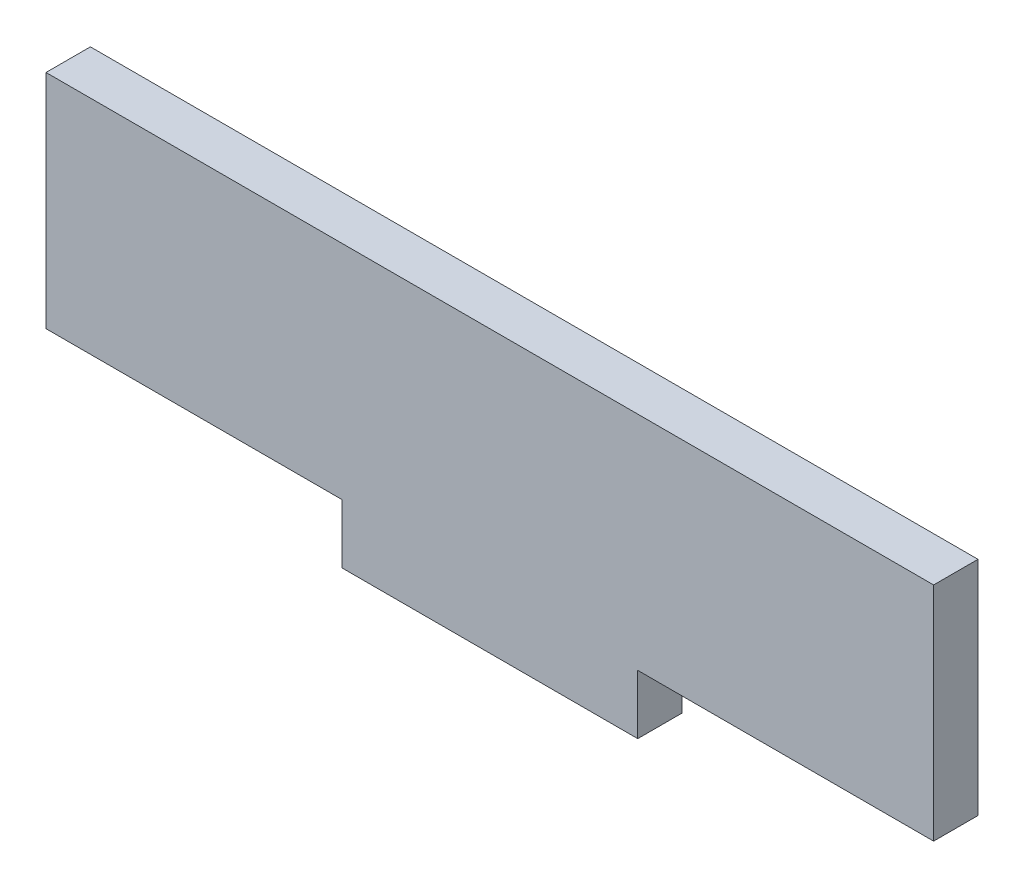
ISO-10303-21;
HEADER;
FILE_DESCRIPTION(('STEP AP214'),'2;1');
FILE_NAME('part.step','',(''),(''),'','','');
FILE_SCHEMA(('AUTOMOTIVE_DESIGN { 1 0 10303 214 1 1 1 1 }'));
ENDSEC;
DATA;
#1=APPLICATION_CONTEXT('core data for automotive mechanical design processes');
#2=APPLICATION_PROTOCOL_DEFINITION('international standard','automotive_design',2000,#1);
#3=PRODUCT_CONTEXT('',#1,'mechanical');
#4=PRODUCT('Part','Part','',(#3));
#5=PRODUCT_RELATED_PRODUCT_CATEGORY('part','',(#4));
#6=PRODUCT_DEFINITION_FORMATION('','',#4);
#7=PRODUCT_DEFINITION_CONTEXT('part definition',#1,'design');
#8=PRODUCT_DEFINITION('design','',#6,#7);
#9=PRODUCT_DEFINITION_SHAPE('','',#8);
#10=(LENGTH_UNIT() NAMED_UNIT(*) SI_UNIT(.MILLI.,.METRE.));
#11=(NAMED_UNIT(*) PLANE_ANGLE_UNIT() SI_UNIT($,.RADIAN.));
#12=(NAMED_UNIT(*) SI_UNIT($,.STERADIAN.) SOLID_ANGLE_UNIT());
#13=UNCERTAINTY_MEASURE_WITH_UNIT(LENGTH_MEASURE(1.E-05),#10,'distance_accuracy_value','');
#14=(GEOMETRIC_REPRESENTATION_CONTEXT(3) GLOBAL_UNCERTAINTY_ASSIGNED_CONTEXT((#13)) GLOBAL_UNIT_ASSIGNED_CONTEXT((#10,
#11,#12)) REPRESENTATION_CONTEXT('',''));
#15=CARTESIAN_POINT('',(0.,0.,0.));
#16=DIRECTION('',(0.,0.,1.));
#17=DIRECTION('',(1.,0.,0.));
#18=AXIS2_PLACEMENT_3D('',#15,#16,#17);
#19=CARTESIAN_POINT('',(20.,0.,3.));
#20=DIRECTION('',(0.,1.,0.));
#21=DIRECTION('',(0.,0.,1.));
#22=AXIS2_PLACEMENT_3D('',#19,#20,#21);
#23=PLANE('',#22);
#24=DIRECTION('',(1.,0.,0.));
#25=VECTOR('',#24,1.);
#26=CARTESIAN_POINT('',(20.,0.,0.));
#27=LINE('',#26,#25);
#28=CARTESIAN_POINT('',(0.,0.,0.));
#29=VERTEX_POINT('',#28);
#30=CARTESIAN_POINT('',(20.,0.,0.));
#31=VERTEX_POINT('',#30);
#32=EDGE_CURVE('E129',#29,#31,#27,.T.);
#33=ORIENTED_EDGE('',*,*,#32,.T.);
#34=DIRECTION('',(0.,0.,-1.));
#35=VECTOR('',#34,1.);
#36=CARTESIAN_POINT('',(20.,0.,3.));
#37=LINE('',#36,#35);
#38=CARTESIAN_POINT('',(20.,0.,3.));
#39=VERTEX_POINT('',#38);
#40=EDGE_CURVE('E11',#39,#31,#37,.T.);
#41=ORIENTED_EDGE('',*,*,#40,.F.);
#42=DIRECTION('',(1.,0.,0.));
#43=VECTOR('',#42,1.);
#44=CARTESIAN_POINT('',(20.,0.,3.));
#45=LINE('',#44,#43);
#46=CARTESIAN_POINT('',(0.,0.,3.));
#47=VERTEX_POINT('',#46);
#48=EDGE_CURVE('E143',#47,#39,#45,.T.);
#49=ORIENTED_EDGE('',*,*,#48,.F.);
#50=DIRECTION('',(0.,0.,-1.));
#51=VECTOR('',#50,1.);
#52=CARTESIAN_POINT('',(0.,0.,3.));
#53=LINE('',#52,#51);
#54=EDGE_CURVE('E125',#47,#29,#53,.T.);
#55=ORIENTED_EDGE('',*,*,#54,.T.);
#56=EDGE_LOOP('',(#33,#41,#49,#55));
#57=FACE_BOUND('',#56,.T.);
#58=ADVANCED_FACE('F33',(#57),#23,.F.);
#59=CARTESIAN_POINT('',(20.,-4.,3.));
#60=DIRECTION('',(1.,0.,0.));
#61=DIRECTION('',(0.,0.,-1.));
#62=AXIS2_PLACEMENT_3D('',#59,#60,#61);
#63=PLANE('',#62);
#64=DIRECTION('',(0.,-1.,0.));
#65=VECTOR('',#64,1.);
#66=CARTESIAN_POINT('',(20.,-4.,0.));
#67=LINE('',#66,#65);
#68=CARTESIAN_POINT('',(20.,-4.,0.));
#69=VERTEX_POINT('',#68);
#70=EDGE_CURVE('E132',#31,#69,#67,.T.);
#71=ORIENTED_EDGE('',*,*,#70,.T.);
#72=DIRECTION('',(0.,0.,-1.));
#73=VECTOR('',#72,1.);
#74=CARTESIAN_POINT('',(20.,-4.,3.));
#75=LINE('',#74,#73);
#76=CARTESIAN_POINT('',(20.,-4.,3.));
#77=VERTEX_POINT('',#76);
#78=EDGE_CURVE('E41',#77,#69,#75,.T.);
#79=ORIENTED_EDGE('',*,*,#78,.F.);
#80=DIRECTION('',(0.,-1.,0.));
#81=VECTOR('',#80,1.);
#82=CARTESIAN_POINT('',(20.,-4.,3.));
#83=LINE('',#82,#81);
#84=EDGE_CURVE('E92',#39,#77,#83,.T.);
#85=ORIENTED_EDGE('',*,*,#84,.F.);
#86=ORIENTED_EDGE('',*,*,#40,.T.);
#87=EDGE_LOOP('',(#71,#79,#85,#86));
#88=FACE_BOUND('',#87,.T.);
#89=ADVANCED_FACE('F178',(#88),#63,.F.);
#90=CARTESIAN_POINT('',(40.,-4.,3.));
#91=DIRECTION('',(0.,1.,0.));
#92=DIRECTION('',(0.,0.,1.));
#93=AXIS2_PLACEMENT_3D('',#90,#91,#92);
#94=PLANE('',#93);
#95=DIRECTION('',(1.,0.,0.));
#96=VECTOR('',#95,1.);
#97=CARTESIAN_POINT('',(40.,-4.,0.));
#98=LINE('',#97,#96);
#99=CARTESIAN_POINT('',(40.,-4.,0.));
#100=VERTEX_POINT('',#99);
#101=EDGE_CURVE('E134',#69,#100,#98,.T.);
#102=ORIENTED_EDGE('',*,*,#101,.T.);
#103=DIRECTION('',(0.,0.,-1.));
#104=VECTOR('',#103,1.);
#105=CARTESIAN_POINT('',(40.,-4.,3.));
#106=LINE('',#105,#104);
#107=CARTESIAN_POINT('',(40.,-4.,3.));
#108=VERTEX_POINT('',#107);
#109=EDGE_CURVE('E150',#108,#100,#106,.T.);
#110=ORIENTED_EDGE('',*,*,#109,.F.);
#111=DIRECTION('',(1.,0.,0.));
#112=VECTOR('',#111,1.);
#113=CARTESIAN_POINT('',(40.,-4.,3.));
#114=LINE('',#113,#112);
#115=EDGE_CURVE('E158',#77,#108,#114,.T.);
#116=ORIENTED_EDGE('',*,*,#115,.F.);
#117=ORIENTED_EDGE('',*,*,#78,.T.);
#118=EDGE_LOOP('',(#102,#110,#116,#117));
#119=FACE_BOUND('',#118,.T.);
#120=ADVANCED_FACE('F156',(#119),#94,.F.);
#121=CARTESIAN_POINT('',(40.,0.,3.));
#122=DIRECTION('',(-1.,0.,0.));
#123=DIRECTION('',(0.,-1.,0.));
#124=AXIS2_PLACEMENT_3D('',#121,#122,#123);
#125=PLANE('',#124);
#126=DIRECTION('',(0.,1.,0.));
#127=VECTOR('',#126,1.);
#128=CARTESIAN_POINT('',(40.,0.,0.));
#129=LINE('',#128,#127);
#130=CARTESIAN_POINT('',(40.,0.,0.));
#131=VERTEX_POINT('',#130);
#132=EDGE_CURVE('E136',#100,#131,#129,.T.);
#133=ORIENTED_EDGE('',*,*,#132,.T.);
#134=DIRECTION('',(0.,0.,-1.));
#135=VECTOR('',#134,1.);
#136=CARTESIAN_POINT('',(40.,0.,3.));
#137=LINE('',#136,#135);
#138=CARTESIAN_POINT('',(40.,0.,3.));
#139=VERTEX_POINT('',#138);
#140=EDGE_CURVE('E147',#139,#131,#137,.T.);
#141=ORIENTED_EDGE('',*,*,#140,.F.);
#142=DIRECTION('',(0.,1.,0.));
#143=VECTOR('',#142,1.);
#144=CARTESIAN_POINT('',(40.,0.,3.));
#145=LINE('',#144,#143);
#146=EDGE_CURVE('E170',#108,#139,#145,.T.);
#147=ORIENTED_EDGE('',*,*,#146,.F.);
#148=ORIENTED_EDGE('',*,*,#109,.T.);
#149=EDGE_LOOP('',(#133,#141,#147,#148));
#150=FACE_BOUND('',#149,.T.);
#151=ADVANCED_FACE('F166',(#150),#125,.F.);
#152=CARTESIAN_POINT('',(60.,0.,3.));
#153=DIRECTION('',(0.,1.,0.));
#154=DIRECTION('',(0.,0.,1.));
#155=AXIS2_PLACEMENT_3D('',#152,#153,#154);
#156=PLANE('',#155);
#157=DIRECTION('',(1.,0.,0.));
#158=VECTOR('',#157,1.);
#159=CARTESIAN_POINT('',(60.,0.,0.));
#160=LINE('',#159,#158);
#161=CARTESIAN_POINT('',(60.,0.,0.));
#162=VERTEX_POINT('',#161);
#163=EDGE_CURVE('E138',#131,#162,#160,.T.);
#164=ORIENTED_EDGE('',*,*,#163,.T.);
#165=DIRECTION('',(0.,0.,-1.));
#166=VECTOR('',#165,1.);
#167=CARTESIAN_POINT('',(60.,0.,3.));
#168=LINE('',#167,#166);
#169=CARTESIAN_POINT('',(60.,0.,3.));
#170=VERTEX_POINT('',#169);
#171=EDGE_CURVE('E120',#170,#162,#168,.T.);
#172=ORIENTED_EDGE('',*,*,#171,.F.);
#173=DIRECTION('',(1.,0.,0.));
#174=VECTOR('',#173,1.);
#175=CARTESIAN_POINT('',(60.,0.,3.));
#176=LINE('',#175,#174);
#177=EDGE_CURVE('E111',#139,#170,#176,.T.);
#178=ORIENTED_EDGE('',*,*,#177,.F.);
#179=ORIENTED_EDGE('',*,*,#140,.T.);
#180=EDGE_LOOP('',(#164,#172,#178,#179));
#181=FACE_BOUND('',#180,.T.);
#182=ADVANCED_FACE('F169',(#181),#156,.F.);
#183=CARTESIAN_POINT('',(60.,15.,3.));
#184=DIRECTION('',(-1.,0.,0.));
#185=DIRECTION('',(0.,0.,1.));
#186=AXIS2_PLACEMENT_3D('',#183,#184,#185);
#187=PLANE('',#186);
#188=DIRECTION('',(0.,1.,0.));
#189=VECTOR('',#188,1.);
#190=CARTESIAN_POINT('',(60.,15.,0.));
#191=LINE('',#190,#189);
#192=CARTESIAN_POINT('',(60.,15.,0.));
#193=VERTEX_POINT('',#192);
#194=EDGE_CURVE('E119',#162,#193,#191,.T.);
#195=ORIENTED_EDGE('',*,*,#194,.T.);
#196=DIRECTION('',(0.,0.,-1.));
#197=VECTOR('',#196,1.);
#198=CARTESIAN_POINT('',(60.,15.,3.));
#199=LINE('',#198,#197);
#200=CARTESIAN_POINT('',(60.,15.,3.));
#201=VERTEX_POINT('',#200);
#202=EDGE_CURVE('E116',#201,#193,#199,.T.);
#203=ORIENTED_EDGE('',*,*,#202,.F.);
#204=DIRECTION('',(0.,1.,0.));
#205=VECTOR('',#204,1.);
#206=CARTESIAN_POINT('',(60.,15.,3.));
#207=LINE('',#206,#205);
#208=EDGE_CURVE('E105',#170,#201,#207,.T.);
#209=ORIENTED_EDGE('',*,*,#208,.F.);
#210=ORIENTED_EDGE('',*,*,#171,.T.);
#211=EDGE_LOOP('',(#195,#203,#209,#210));
#212=FACE_BOUND('',#211,.T.);
#213=ADVANCED_FACE('F117',(#212),#187,.F.);
#214=CARTESIAN_POINT('',(0.,15.,3.));
#215=DIRECTION('',(0.,-1.,0.));
#216=DIRECTION('',(0.,0.,-1.));
#217=AXIS2_PLACEMENT_3D('',#214,#215,#216);
#218=PLANE('',#217);
#219=DIRECTION('',(-1.,0.,0.));
#220=VECTOR('',#219,1.);
#221=CARTESIAN_POINT('',(0.,15.,0.));
#222=LINE('',#221,#220);
#223=CARTESIAN_POINT('',(0.,15.,0.));
#224=VERTEX_POINT('',#223);
#225=EDGE_CURVE('E78',#193,#224,#222,.T.);
#226=ORIENTED_EDGE('',*,*,#225,.T.);
#227=DIRECTION('',(0.,0.,-1.));
#228=VECTOR('',#227,1.);
#229=CARTESIAN_POINT('',(0.,15.,3.));
#230=LINE('',#229,#228);
#231=CARTESIAN_POINT('',(0.,15.,3.));
#232=VERTEX_POINT('',#231);
#233=EDGE_CURVE('E121',#232,#224,#230,.T.);
#234=ORIENTED_EDGE('',*,*,#233,.F.);
#235=DIRECTION('',(-1.,0.,0.));
#236=VECTOR('',#235,1.);
#237=CARTESIAN_POINT('',(0.,15.,3.));
#238=LINE('',#237,#236);
#239=EDGE_CURVE('E109',#201,#232,#238,.T.);
#240=ORIENTED_EDGE('',*,*,#239,.F.);
#241=ORIENTED_EDGE('',*,*,#202,.T.);
#242=EDGE_LOOP('',(#226,#234,#240,#241));
#243=FACE_BOUND('',#242,.T.);
#244=ADVANCED_FACE('F123',(#243),#218,.F.);
#245=CARTESIAN_POINT('',(0.,0.,3.));
#246=DIRECTION('',(1.,0.,0.));
#247=DIRECTION('',(0.,0.,-1.));
#248=AXIS2_PLACEMENT_3D('',#245,#246,#247);
#249=PLANE('',#248);
#250=DIRECTION('',(0.,-1.,0.));
#251=VECTOR('',#250,1.);
#252=CARTESIAN_POINT('',(0.,0.,0.));
#253=LINE('',#252,#251);
#254=EDGE_CURVE('E84',#224,#29,#253,.T.);
#255=ORIENTED_EDGE('',*,*,#254,.T.);
#256=ORIENTED_EDGE('',*,*,#54,.F.);
#257=DIRECTION('',(0.,-1.,0.));
#258=VECTOR('',#257,1.);
#259=CARTESIAN_POINT('',(0.,0.,3.));
#260=LINE('',#259,#258);
#261=EDGE_CURVE('E49',#232,#47,#260,.T.);
#262=ORIENTED_EDGE('',*,*,#261,.F.);
#263=ORIENTED_EDGE('',*,*,#233,.T.);
#264=EDGE_LOOP('',(#255,#256,#262,#263));
#265=FACE_BOUND('',#264,.T.);
#266=ADVANCED_FACE('F194',(#265),#249,.F.);
#267=CARTESIAN_POINT('',(0.,0.,3.));
#268=DIRECTION('',(0.,0.,-1.));
#269=DIRECTION('',(-1.,0.,0.));
#270=AXIS2_PLACEMENT_3D('',#267,#268,#269);
#271=PLANE('',#270);
#272=ORIENTED_EDGE('',*,*,#48,.T.);
#273=ORIENTED_EDGE('',*,*,#84,.T.);
#274=ORIENTED_EDGE('',*,*,#115,.T.);
#275=ORIENTED_EDGE('',*,*,#146,.T.);
#276=ORIENTED_EDGE('',*,*,#177,.T.);
#277=ORIENTED_EDGE('',*,*,#208,.T.);
#278=ORIENTED_EDGE('',*,*,#239,.T.);
#279=ORIENTED_EDGE('',*,*,#261,.T.);
#280=EDGE_LOOP('',(#272,#273,#274,#275,#276,#277,#278,#279));
#281=FACE_BOUND('',#280,.T.);
#282=ADVANCED_FACE('F107',(#281),#271,.F.);
#283=CARTESIAN_POINT('',(0.,0.,0.));
#284=DIRECTION('',(0.,0.,-1.));
#285=DIRECTION('',(-1.,0.,0.));
#286=AXIS2_PLACEMENT_3D('',#283,#284,#285);
#287=PLANE('',#286);
#288=ORIENTED_EDGE('',*,*,#32,.F.);
#289=ORIENTED_EDGE('',*,*,#254,.F.);
#290=ORIENTED_EDGE('',*,*,#225,.F.);
#291=ORIENTED_EDGE('',*,*,#194,.F.);
#292=ORIENTED_EDGE('',*,*,#163,.F.);
#293=ORIENTED_EDGE('',*,*,#132,.F.);
#294=ORIENTED_EDGE('',*,*,#101,.F.);
#295=ORIENTED_EDGE('',*,*,#70,.F.);
#296=EDGE_LOOP('',(#288,#289,#290,#291,#292,#293,#294,#295));
#297=FACE_BOUND('',#296,.T.);
#298=ADVANCED_FACE('F162',(#297),#287,.T.);
#299=CLOSED_SHELL('',(#58,#89,#120,#151,#182,#213,#244,#266,#282,#298));
#300=MANIFOLD_SOLID_BREP('B2',#299);
#301=ADVANCED_BREP_SHAPE_REPRESENTATION('',(#18,#300),#14);
#302=SHAPE_DEFINITION_REPRESENTATION(#9,#301);
ENDSEC;
END-ISO-10303-21;
